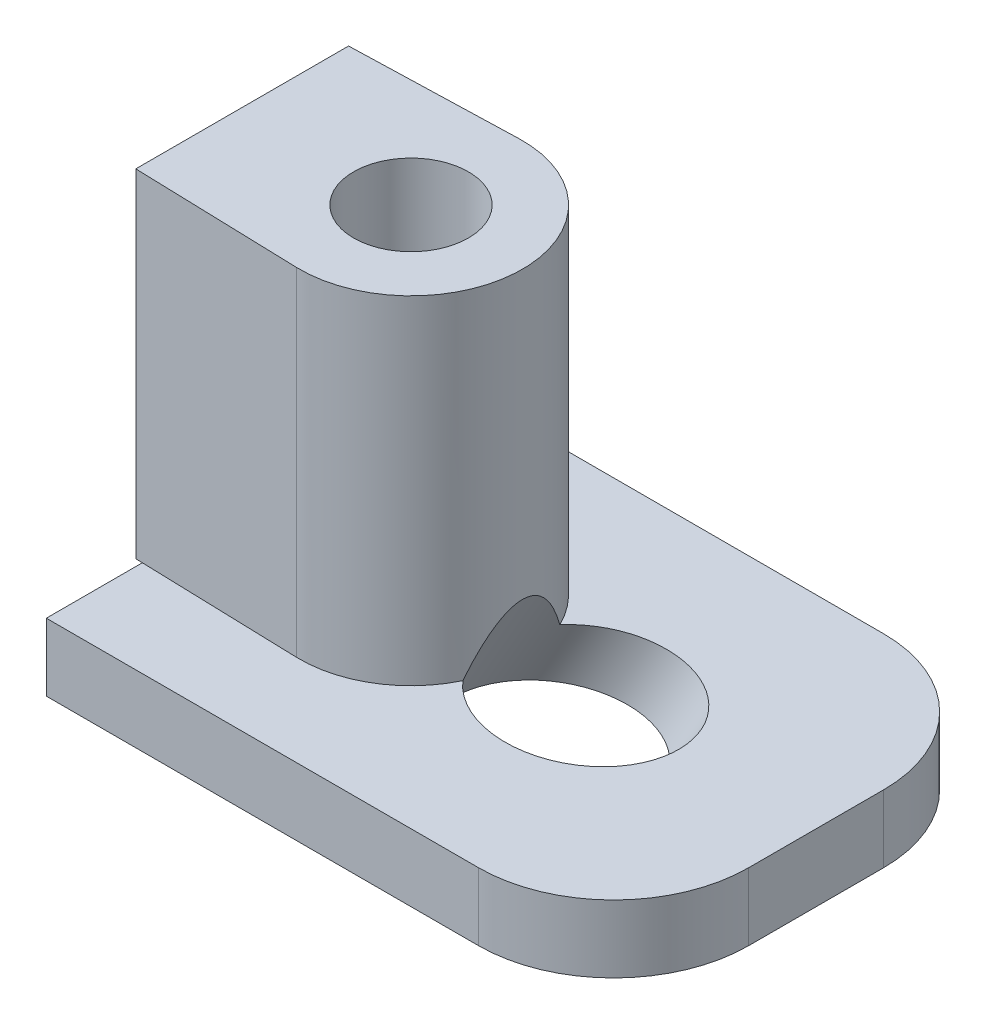
ISO-10303-21;
HEADER;
FILE_DESCRIPTION(('STEP AP214'),'2;1');
FILE_NAME('part.step','',(''),(''),'','','');
FILE_SCHEMA(('AUTOMOTIVE_DESIGN { 1 0 10303 214 1 1 1 1 }'));
ENDSEC;
DATA;
#1=APPLICATION_CONTEXT('core data for automotive mechanical design processes');
#2=APPLICATION_PROTOCOL_DEFINITION('international standard','automotive_design',2000,#1);
#3=PRODUCT_CONTEXT('',#1,'mechanical');
#4=PRODUCT('Part','Part','',(#3));
#5=PRODUCT_RELATED_PRODUCT_CATEGORY('part','',(#4));
#6=PRODUCT_DEFINITION_FORMATION('','',#4);
#7=PRODUCT_DEFINITION_CONTEXT('part definition',#1,'design');
#8=PRODUCT_DEFINITION('design','',#6,#7);
#9=PRODUCT_DEFINITION_SHAPE('','',#8);
#10=(LENGTH_UNIT() NAMED_UNIT(*) SI_UNIT(.MILLI.,.METRE.));
#11=(NAMED_UNIT(*) PLANE_ANGLE_UNIT() SI_UNIT($,.RADIAN.));
#12=(NAMED_UNIT(*) SI_UNIT($,.STERADIAN.) SOLID_ANGLE_UNIT());
#13=UNCERTAINTY_MEASURE_WITH_UNIT(LENGTH_MEASURE(1.E-05),#10,'distance_accuracy_value','');
#14=(GEOMETRIC_REPRESENTATION_CONTEXT(3) GLOBAL_UNCERTAINTY_ASSIGNED_CONTEXT((#13)) GLOBAL_UNIT_ASSIGNED_CONTEXT((#10,
#11,#12)) REPRESENTATION_CONTEXT('',''));
#15=CARTESIAN_POINT('',(0.,0.,0.));
#16=DIRECTION('',(0.,0.,1.));
#17=DIRECTION('',(1.,0.,0.));
#18=AXIS2_PLACEMENT_3D('',#15,#16,#17);
#19=CARTESIAN_POINT('',(2.5,7.75,0.));
#20=DIRECTION('',(0.,1.,0.));
#21=DIRECTION('',(0.,0.,1.));
#22=AXIS2_PLACEMENT_3D('',#19,#20,#21);
#23=PLANE('',#22);
#24=DIRECTION('',(0.,0.,-1.));
#25=VECTOR('',#24,1.);
#26=CARTESIAN_POINT('',(1.30000000001017,7.75,1.49999999996326));
#27=LINE('',#26,#25);
#28=CARTESIAN_POINT('',(1.30000000001017,7.75,0.789194940442877));
#29=VERTEX_POINT('',#28);
#30=CARTESIAN_POINT('',(1.30000000001017,7.75,-0.789194940442877));
#31=VERTEX_POINT('',#30);
#32=EDGE_CURVE('E48',#29,#31,#27,.T.);
#33=ORIENTED_EDGE('',*,*,#32,.F.);
#34=DIRECTION('',(0.99954579976556,0.,0.0301362600703334));
#35=VECTOR('',#34,1.);
#36=CARTESIAN_POINT('',(2.47513758544198,7.75,0.824625284806589));
#37=LINE('',#36,#35);
#38=CARTESIAN_POINT('',(1.25000000001017,7.75,0.787687442733547));
#39=VERTEX_POINT('',#38);
#40=EDGE_CURVE('E382',#39,#29,#37,.T.);
#41=ORIENTED_EDGE('',*,*,#40,.F.);
#42=DIRECTION('',(0.,0.,1.));
#43=VECTOR('',#42,1.);
#44=CARTESIAN_POINT('',(1.25000000001017,7.75,0.787687442733547));
#45=LINE('',#44,#43);
#46=CARTESIAN_POINT('',(1.25000000001017,7.75,-0.787687442733547));
#47=VERTEX_POINT('',#46);
#48=EDGE_CURVE('E379',#47,#39,#45,.T.);
#49=ORIENTED_EDGE('',*,*,#48,.F.);
#50=DIRECTION('',(-0.99954579976556,0.,0.0301362600703315));
#51=VECTOR('',#50,1.);
#52=CARTESIAN_POINT('',(1.25000000001017,7.75,-0.787687442733547));
#53=LINE('',#52,#51);
#54=EDGE_CURVE('E370',#31,#47,#53,.T.);
#55=ORIENTED_EDGE('',*,*,#54,.F.);
#56=EDGE_LOOP('',(#33,#41,#49,#55));
#57=FACE_BOUND('',#56,.T.);
#58=ADVANCED_FACE('F39',(#57),#23,.F.);
#59=CARTESIAN_POINT('',(2.5,9.25,0.));
#60=DIRECTION('',(0.,-1.,0.));
#61=DIRECTION('',(0.,0.,-1.));
#62=AXIS2_PLACEMENT_3D('',#59,#60,#61);
#63=CYLINDRICAL_SURFACE('',#62,0.825000000000001);
#64=CARTESIAN_POINT('',(2.5,7.75,0.));
#65=DIRECTION('',(0.,1.,0.));
#66=DIRECTION('',(0.,0.,1.));
#67=AXIS2_PLACEMENT_3D('',#64,#65,#66);
#68=CIRCLE('',#67,0.825000000000001);
#69=CARTESIAN_POINT('',(2.47513758544198,7.75,0.824625284806589));
#70=VERTEX_POINT('',#69);
#71=CARTESIAN_POINT('',(3.2427713292277,7.75,0.359048398516585));
#72=VERTEX_POINT('',#71);
#73=EDGE_CURVE('E368',#70,#72,#68,.T.);
#74=ORIENTED_EDGE('',*,*,#73,.T.);
#75=CARTESIAN_POINT('',(3.2427713292277,7.75,0.359048398516585));
#76=CARTESIAN_POINT('',(3.24734672347552,7.77217971307887,0.349565049921853));
#77=CARTESIAN_POINT('',(3.25192600277813,7.79418896030448,0.33964566753348));
#78=CARTESIAN_POINT('',(3.26106805188744,7.83780146526785,0.318646845721492));
#79=CARTESIAN_POINT('',(3.26563059435548,7.85940184355562,0.307561357337247));
#80=CARTESIAN_POINT('',(3.27483349496606,7.90268314619792,0.28359900724088));
#81=CARTESIAN_POINT('',(3.27947033327997,7.92433658834901,0.270670478878927));
#82=CARTESIAN_POINT('',(3.28854048447935,7.96644084771411,0.242985116613794));
#83=CARTESIAN_POINT('',(3.29297426897767,7.98689448628587,0.228232848119379));
#84=CARTESIAN_POINT('',(3.30055565002327,8.02169384050402,0.199757082741822));
#85=CARTESIAN_POINT('',(3.30377388010276,8.03640319300004,0.186502368601944));
#86=CARTESIAN_POINT('',(3.3098203207619,8.06394792303974,0.158191350371955));
#87=CARTESIAN_POINT('',(3.31265093437802,8.07679487870224,0.143147338628181));
#88=CARTESIAN_POINT('',(3.31676217281508,8.09540823105043,0.116754702154036));
#89=CARTESIAN_POINT('',(3.31823160844037,8.10204826763883,0.106059049926062));
#90=CARTESIAN_POINT('',(3.32081305778399,8.11369928252237,0.0837634575396931));
#91=CARTESIAN_POINT('',(3.32192551622894,8.1187122878832,0.0721646650986338));
#92=CARTESIAN_POINT('',(3.32352855059013,8.12593093021106,0.050249048831502));
#93=CARTESIAN_POINT('',(3.32409262549927,8.12846862260195,0.0400487219740886));
#94=CARTESIAN_POINT('',(3.32483773061379,8.13182010354673,0.0193539820251326));
#95=CARTESIAN_POINT('',(3.32501905805271,8.13263522980936,0.00885980355493707));
#96=CARTESIAN_POINT('',(3.32497771259252,8.13244932465132,-0.0121243160797312));
#97=CARTESIAN_POINT('',(3.32475453893937,8.1314460421229,-0.0226142358903848));
#98=CARTESIAN_POINT('',(3.32392954484907,8.12773491274186,-0.0432704549303667));
#99=CARTESIAN_POINT('',(3.32332742774229,8.12502573036279,-0.0534364940404541));
#100=CARTESIAN_POINT('',(3.3215517727802,8.11702845306051,-0.0764987713816014));
#101=CARTESIAN_POINT('',(3.32025530931587,8.11118467727236,-0.0891905515857784));
#102=CARTESIAN_POINT('',(3.31725174901187,8.09762121101009,-0.1134683712181));
#103=CARTESIAN_POINT('',(3.3155437219126,8.0898972703788,-0.12505182140944));
#104=CARTESIAN_POINT('',(3.31047880905792,8.0669416220475,-0.155342848088699));
#105=CARTESIAN_POINT('',(3.30683682327192,8.05038263487886,-0.172982147986076));
#106=CARTESIAN_POINT('',(3.29909159161891,8.0149946757332,-0.205823776531038));
#107=CARTESIAN_POINT('',(3.29498527036661,7.99615050094222,-0.221008018210512));
#108=CARTESIAN_POINT('',(3.28691564265625,7.9589102788101,-0.248131167074746));
#109=CARTESIAN_POINT('',(3.2829737224174,7.94063145414876,-0.260239966936255));
#110=CARTESIAN_POINT('',(3.27496842011141,7.90329940773891,-0.283190139279665));
#111=CARTESIAN_POINT('',(3.27090489842919,7.88424528605347,-0.294029978767528));
#112=CARTESIAN_POINT('',(3.26283619408453,7.84617097550688,-0.314359991022478));
#113=CARTESIAN_POINT('',(3.25883284513023,7.82716647818218,-0.323880617454054));
#114=CARTESIAN_POINT('',(3.25080948153018,7.78881967149931,-0.342062365870405));
#115=CARTESIAN_POINT('',(3.2467895441114,7.7694784476414,-0.350725802804259));
#116=CARTESIAN_POINT('',(3.2427713292277,7.75,-0.35904839851659));
#117=B_SPLINE_CURVE_WITH_KNOTS('',3,(#75,#76,#77,#78,#79,#80,#81,#82,#83,#84,#85,#86,#87,#88,
#89,#90,#91,#92,#93,#94,#95,#96,#97,#98,#99,#100,#101,#102,#103,#104,#105,#106,#107,#108,#109,
#110,#111,#112,#113,#114,#115,#116),.UNSPECIFIED.,.F.,.F.,(4,2,2,2,2,2,2,2,2,2,2,2,2,2,2,2,2,2,
2,2,4),(0.,0.0736749599645764,0.147752939160669,0.224614953753801,0.301288312807912,
0.361361320483473,0.421043184119437,0.458961245695404,0.49683188340662,0.528275531905357,
0.559694752939033,0.59115289611565,0.622635698129949,0.664494694214626,0.70644920690254,
0.779437629745386,0.852941425440353,0.919708409452639,0.986555238036391,1.05142330953229,
1.11611111969407),.UNSPECIFIED.);
#118=CARTESIAN_POINT('',(3.2427713292277,7.75,-0.359048398516584));
#119=VERTEX_POINT('',#118);
#120=EDGE_CURVE('E53',#72,#119,#117,.T.);
#121=ORIENTED_EDGE('',*,*,#120,.T.);
#122=CARTESIAN_POINT('',(2.47513758544198,7.75,-0.824625284806588));
#123=VERTEX_POINT('',#122);
#124=EDGE_CURVE('E136',#119,#123,#68,.T.);
#125=ORIENTED_EDGE('',*,*,#124,.T.);
#126=DIRECTION('',(0.,-1.,0.));
#127=VECTOR('',#126,1.);
#128=CARTESIAN_POINT('',(2.47513758544198,9.25,-0.824625284806588));
#129=LINE('',#128,#127);
#130=CARTESIAN_POINT('',(2.47513758544198,10.25,-0.824625284806588));
#131=VERTEX_POINT('',#130);
#132=EDGE_CURVE('E129',#131,#123,#129,.T.);
#133=ORIENTED_EDGE('',*,*,#132,.F.);
#134=CARTESIAN_POINT('',(2.5,10.25,0.));
#135=DIRECTION('',(0.,1.,0.));
#136=DIRECTION('',(0.,0.,1.));
#137=AXIS2_PLACEMENT_3D('',#134,#135,#136);
#138=CIRCLE('',#137,0.825000000000001);
#139=CARTESIAN_POINT('',(2.47513758544198,10.25,0.824625284806589));
#140=VERTEX_POINT('',#139);
#141=EDGE_CURVE('E134',#140,#131,#138,.T.);
#142=ORIENTED_EDGE('',*,*,#141,.F.);
#143=DIRECTION('',(0.,-1.,0.));
#144=VECTOR('',#143,1.);
#145=CARTESIAN_POINT('',(2.47513758544198,9.25,0.824625284806589));
#146=LINE('',#145,#144);
#147=EDGE_CURVE('E369',#140,#70,#146,.T.);
#148=ORIENTED_EDGE('',*,*,#147,.T.);
#149=EDGE_LOOP('',(#74,#121,#125,#133,#142,#148));
#150=FACE_BOUND('',#149,.T.);
#151=ADVANCED_FACE('F41',(#150),#63,.T.);
#152=CARTESIAN_POINT('',(1.25000000001017,9.25,-0.787687442733547));
#153=DIRECTION('',(0.0301362600703315,0.,0.99954579976556));
#154=DIRECTION('',(0.99954579976556,0.,-0.0301362600703315));
#155=AXIS2_PLACEMENT_3D('',#152,#153,#154);
#156=PLANE('',#155);
#157=EDGE_CURVE('E372',#123,#31,#53,.T.);
#158=ORIENTED_EDGE('',*,*,#157,.T.);
#159=ORIENTED_EDGE('',*,*,#54,.T.);
#160=DIRECTION('',(0.,-1.,0.));
#161=VECTOR('',#160,1.);
#162=CARTESIAN_POINT('',(1.25000000001017,9.25,-0.787687442733547));
#163=LINE('',#162,#161);
#164=CARTESIAN_POINT('',(1.25000000001017,10.25,-0.787687442733547));
#165=VERTEX_POINT('',#164);
#166=EDGE_CURVE('E139',#165,#47,#163,.T.);
#167=ORIENTED_EDGE('',*,*,#166,.F.);
#168=DIRECTION('',(-0.99954579976556,0.,0.0301362600703315));
#169=VECTOR('',#168,1.);
#170=CARTESIAN_POINT('',(2.47513758544198,10.25,-0.824625284806588));
#171=LINE('',#170,#169);
#172=EDGE_CURVE('E141',#131,#165,#171,.T.);
#173=ORIENTED_EDGE('',*,*,#172,.F.);
#174=ORIENTED_EDGE('',*,*,#132,.T.);
#175=EDGE_LOOP('',(#158,#159,#167,#173,#174));
#176=FACE_BOUND('',#175,.T.);
#177=ADVANCED_FACE('F142',(#176),#156,.F.);
#178=CARTESIAN_POINT('',(1.25000000001017,9.25,0.787687442733547));
#179=DIRECTION('',(1.,0.,0.));
#180=DIRECTION('',(0.,0.,-1.));
#181=AXIS2_PLACEMENT_3D('',#178,#179,#180);
#182=PLANE('',#181);
#183=ORIENTED_EDGE('',*,*,#48,.T.);
#184=DIRECTION('',(0.,-1.,0.));
#185=VECTOR('',#184,1.);
#186=CARTESIAN_POINT('',(1.25000000001017,9.25,0.787687442733547));
#187=LINE('',#186,#185);
#188=CARTESIAN_POINT('',(1.25000000001017,10.25,0.787687442733547));
#189=VERTEX_POINT('',#188);
#190=EDGE_CURVE('E385',#189,#39,#187,.T.);
#191=ORIENTED_EDGE('',*,*,#190,.F.);
#192=DIRECTION('',(0.,0.,1.));
#193=VECTOR('',#192,1.);
#194=CARTESIAN_POINT('',(1.25000000001017,10.25,-0.787687442733547));
#195=LINE('',#194,#193);
#196=EDGE_CURVE('E147',#165,#189,#195,.T.);
#197=ORIENTED_EDGE('',*,*,#196,.F.);
#198=ORIENTED_EDGE('',*,*,#166,.T.);
#199=EDGE_LOOP('',(#183,#191,#197,#198));
#200=FACE_BOUND('',#199,.T.);
#201=ADVANCED_FACE('F224',(#200),#182,.F.);
#202=CARTESIAN_POINT('',(2.47513758544198,9.25,0.824625284806589));
#203=DIRECTION('',(0.0301362600703333,0.,-0.99954579976556));
#204=DIRECTION('',(-0.99954579976556,0.,-0.0301362600703334));
#205=AXIS2_PLACEMENT_3D('',#202,#203,#204);
#206=PLANE('',#205);
#207=ORIENTED_EDGE('',*,*,#40,.T.);
#208=EDGE_CURVE('E381',#29,#70,#37,.T.);
#209=ORIENTED_EDGE('',*,*,#208,.T.);
#210=ORIENTED_EDGE('',*,*,#147,.F.);
#211=DIRECTION('',(0.99954579976556,0.,0.0301362600703334));
#212=VECTOR('',#211,1.);
#213=CARTESIAN_POINT('',(1.25000000001017,10.25,0.787687442733547));
#214=LINE('',#213,#212);
#215=EDGE_CURVE('E153',#189,#140,#214,.T.);
#216=ORIENTED_EDGE('',*,*,#215,.F.);
#217=ORIENTED_EDGE('',*,*,#190,.T.);
#218=EDGE_LOOP('',(#207,#209,#210,#216,#217));
#219=FACE_BOUND('',#218,.T.);
#220=ADVANCED_FACE('F182',(#219),#206,.F.);
#221=CARTESIAN_POINT('',(4.50000000001019,7.25,0.499999999963261));
#222=DIRECTION('',(0.,1.,0.));
#223=DIRECTION('',(-1.,0.,0.));
#224=AXIS2_PLACEMENT_3D('',#221,#222,#223);
#225=PLANE('',#224);
#226=CARTESIAN_POINT('',(3.50470053838943,7.25,0.));
#227=DIRECTION('',(0.,1.,0.));
#228=DIRECTION('',(1.,0.,0.));
#229=AXIS2_PLACEMENT_3D('',#226,#227,#228);
#230=ELLIPSE('',#229,0.689240751358572,0.5969);
#231=CARTESIAN_POINT('',(4.193941289748,7.25,0.));
#232=VERTEX_POINT('',#231);
#233=EDGE_CURVE('E169',#232,#232,#230,.T.);
#234=ORIENTED_EDGE('',*,*,#233,.T.);
#235=EDGE_LOOP('',(#234));
#236=FACE_BOUND('',#235,.T.);
#237=DIRECTION('',(-1.,0.,0.));
#238=VECTOR('',#237,1.);
#239=CARTESIAN_POINT('',(1.30000000001017,7.25,1.49999999996326));
#240=LINE('',#239,#238);
#241=CARTESIAN_POINT('',(4.50000000001019,7.25,1.49999999996326));
#242=VERTEX_POINT('',#241);
#243=CARTESIAN_POINT('',(1.30000000001017,7.25,1.49999999996326));
#244=VERTEX_POINT('',#243);
#245=EDGE_CURVE('E411',#242,#244,#240,.T.);
#246=ORIENTED_EDGE('',*,*,#245,.T.);
#247=DIRECTION('',(0.,0.,-1.));
#248=VECTOR('',#247,1.);
#249=CARTESIAN_POINT('',(1.30000000001017,7.25,1.49999999996326));
#250=LINE('',#249,#248);
#251=CARTESIAN_POINT('',(1.30000000001017,7.25,-1.50000000003674));
#252=VERTEX_POINT('',#251);
#253=EDGE_CURVE('E453',#244,#252,#250,.T.);
#254=ORIENTED_EDGE('',*,*,#253,.T.);
#255=DIRECTION('',(1.,0.,0.));
#256=VECTOR('',#255,1.);
#257=CARTESIAN_POINT('',(4.50000000001019,7.25,-1.50000000003674));
#258=LINE('',#257,#256);
#259=CARTESIAN_POINT('',(4.50000000001019,7.25,-1.50000000003674));
#260=VERTEX_POINT('',#259);
#261=EDGE_CURVE('E437',#252,#260,#258,.T.);
#262=ORIENTED_EDGE('',*,*,#261,.T.);
#263=CARTESIAN_POINT('',(4.50000000001019,7.25,-0.500000000036739));
#264=DIRECTION('',(0.,-1.,0.));
#265=DIRECTION('',(-1.,0.,0.));
#266=AXIS2_PLACEMENT_3D('',#263,#264,#265);
#267=CIRCLE('',#266,1.);
#268=CARTESIAN_POINT('',(5.50000000001019,7.25,-0.500000000036739));
#269=VERTEX_POINT('',#268);
#270=EDGE_CURVE('E448',#260,#269,#267,.T.);
#271=ORIENTED_EDGE('',*,*,#270,.T.);
#272=DIRECTION('',(0.,0.,1.));
#273=VECTOR('',#272,1.);
#274=CARTESIAN_POINT('',(5.50000000001019,7.25,0.499999999963261));
#275=LINE('',#274,#273);
#276=CARTESIAN_POINT('',(5.50000000001019,7.25,0.499999999963261));
#277=VERTEX_POINT('',#276);
#278=EDGE_CURVE('E445',#269,#277,#275,.T.);
#279=ORIENTED_EDGE('',*,*,#278,.T.);
#280=CARTESIAN_POINT('',(4.50000000001019,7.25,0.499999999963261));
#281=DIRECTION('',(0.,-1.,0.));
#282=DIRECTION('',(-1.,0.,0.));
#283=AXIS2_PLACEMENT_3D('',#280,#281,#282);
#284=CIRCLE('',#283,1.);
#285=EDGE_CURVE('E416',#277,#242,#284,.T.);
#286=ORIENTED_EDGE('',*,*,#285,.T.);
#287=EDGE_LOOP('',(#246,#254,#262,#271,#279,#286));
#288=FACE_BOUND('',#287,.T.);
#289=ADVANCED_FACE('F178',(#236,#288),#225,.F.);
#290=CARTESIAN_POINT('',(4.50000000001019,7.25,0.499999999963261));
#291=DIRECTION('',(0.,1.,0.));
#292=DIRECTION('',(-1.,0.,0.));
#293=AXIS2_PLACEMENT_3D('',#290,#291,#292);
#294=CYLINDRICAL_SURFACE('',#293,1.);
#295=CARTESIAN_POINT('',(4.50000000001019,7.75,0.499999999963261));
#296=DIRECTION('',(0.,-1.,0.));
#297=DIRECTION('',(-1.,0.,0.));
#298=AXIS2_PLACEMENT_3D('',#295,#296,#297);
#299=CIRCLE('',#298,1.);
#300=CARTESIAN_POINT('',(5.50000000001019,7.75,0.499999999963261));
#301=VERTEX_POINT('',#300);
#302=CARTESIAN_POINT('',(4.50000000001019,7.75,1.49999999996326));
#303=VERTEX_POINT('',#302);
#304=EDGE_CURVE('E409',#301,#303,#299,.T.);
#305=ORIENTED_EDGE('',*,*,#304,.T.);
#306=DIRECTION('',(0.,1.,0.));
#307=VECTOR('',#306,1.);
#308=CARTESIAN_POINT('',(4.50000000001019,7.25,1.49999999996326));
#309=LINE('',#308,#307);
#310=EDGE_CURVE('E412',#242,#303,#309,.T.);
#311=ORIENTED_EDGE('',*,*,#310,.F.);
#312=ORIENTED_EDGE('',*,*,#285,.F.);
#313=DIRECTION('',(0.,1.,0.));
#314=VECTOR('',#313,1.);
#315=CARTESIAN_POINT('',(5.50000000001019,7.25,0.499999999963261));
#316=LINE('',#315,#314);
#317=EDGE_CURVE('E415',#277,#301,#316,.T.);
#318=ORIENTED_EDGE('',*,*,#317,.T.);
#319=EDGE_LOOP('',(#305,#311,#312,#318));
#320=FACE_BOUND('',#319,.T.);
#321=ADVANCED_FACE('F181',(#320),#294,.T.);
#322=CARTESIAN_POINT('',(5.50000000001019,7.25,0.499999999963261));
#323=DIRECTION('',(-1.,0.,0.));
#324=DIRECTION('',(0.,-1.,0.));
#325=AXIS2_PLACEMENT_3D('',#322,#323,#324);
#326=PLANE('',#325);
#327=DIRECTION('',(0.,0.,1.));
#328=VECTOR('',#327,1.);
#329=CARTESIAN_POINT('',(5.50000000001019,7.75,0.499999999963261));
#330=LINE('',#329,#328);
#331=CARTESIAN_POINT('',(5.50000000001019,7.75,-0.500000000036739));
#332=VERTEX_POINT('',#331);
#333=EDGE_CURVE('E407',#332,#301,#330,.T.);
#334=ORIENTED_EDGE('',*,*,#333,.T.);
#335=ORIENTED_EDGE('',*,*,#317,.F.);
#336=ORIENTED_EDGE('',*,*,#278,.F.);
#337=DIRECTION('',(0.,1.,0.));
#338=VECTOR('',#337,1.);
#339=CARTESIAN_POINT('',(5.50000000001019,7.25,-0.500000000036739));
#340=LINE('',#339,#338);
#341=EDGE_CURVE('E419',#269,#332,#340,.T.);
#342=ORIENTED_EDGE('',*,*,#341,.T.);
#343=EDGE_LOOP('',(#334,#335,#336,#342));
#344=FACE_BOUND('',#343,.T.);
#345=ADVANCED_FACE('F192',(#344),#326,.F.);
#346=CARTESIAN_POINT('',(4.50000000001019,7.25,-0.500000000036739));
#347=DIRECTION('',(0.,1.,0.));
#348=DIRECTION('',(-1.,0.,0.));
#349=AXIS2_PLACEMENT_3D('',#346,#347,#348);
#350=CYLINDRICAL_SURFACE('',#349,1.);
#351=CARTESIAN_POINT('',(4.50000000001019,7.75,-0.500000000036739));
#352=DIRECTION('',(0.,-1.,0.));
#353=DIRECTION('',(-1.,0.,0.));
#354=AXIS2_PLACEMENT_3D('',#351,#352,#353);
#355=CIRCLE('',#354,1.);
#356=CARTESIAN_POINT('',(4.50000000001019,7.75,-1.50000000003674));
#357=VERTEX_POINT('',#356);
#358=EDGE_CURVE('E400',#357,#332,#355,.T.);
#359=ORIENTED_EDGE('',*,*,#358,.T.);
#360=ORIENTED_EDGE('',*,*,#341,.F.);
#361=ORIENTED_EDGE('',*,*,#270,.F.);
#362=DIRECTION('',(0.,1.,0.));
#363=VECTOR('',#362,1.);
#364=CARTESIAN_POINT('',(4.50000000001019,7.25,-1.50000000003674));
#365=LINE('',#364,#363);
#366=EDGE_CURVE('E422',#260,#357,#365,.T.);
#367=ORIENTED_EDGE('',*,*,#366,.T.);
#368=EDGE_LOOP('',(#359,#360,#361,#367));
#369=FACE_BOUND('',#368,.T.);
#370=ADVANCED_FACE('F196',(#369),#350,.T.);
#371=CARTESIAN_POINT('',(4.50000000001019,7.25,-1.50000000003674));
#372=DIRECTION('',(0.,0.,1.));
#373=DIRECTION('',(1.,0.,0.));
#374=AXIS2_PLACEMENT_3D('',#371,#372,#373);
#375=PLANE('',#374);
#376=DIRECTION('',(1.,0.,0.));
#377=VECTOR('',#376,1.);
#378=CARTESIAN_POINT('',(4.50000000001019,7.75,-1.50000000003674));
#379=LINE('',#378,#377);
#380=CARTESIAN_POINT('',(1.30000000001017,7.75,-1.50000000003674));
#381=VERTEX_POINT('',#380);
#382=EDGE_CURVE('E397',#381,#357,#379,.T.);
#383=ORIENTED_EDGE('',*,*,#382,.T.);
#384=ORIENTED_EDGE('',*,*,#366,.F.);
#385=ORIENTED_EDGE('',*,*,#261,.F.);
#386=DIRECTION('',(0.,1.,0.));
#387=VECTOR('',#386,1.);
#388=CARTESIAN_POINT('',(1.30000000001017,7.25,-1.50000000003674));
#389=LINE('',#388,#387);
#390=EDGE_CURVE('E425',#252,#381,#389,.T.);
#391=ORIENTED_EDGE('',*,*,#390,.T.);
#392=EDGE_LOOP('',(#383,#384,#385,#391));
#393=FACE_BOUND('',#392,.T.);
#394=ADVANCED_FACE('F200',(#393),#375,.F.);
#395=CARTESIAN_POINT('',(1.30000000001017,7.25,1.49999999996326));
#396=DIRECTION('',(1.,0.,0.));
#397=DIRECTION('',(0.,0.,-1.));
#398=AXIS2_PLACEMENT_3D('',#395,#396,#397);
#399=PLANE('',#398);
#400=CARTESIAN_POINT('',(1.30000000001017,7.75,1.49999999996326));
#401=VERTEX_POINT('',#400);
#402=EDGE_CURVE('E392',#401,#29,#27,.T.);
#403=ORIENTED_EDGE('',*,*,#402,.T.);
#404=ORIENTED_EDGE('',*,*,#32,.T.);
#405=EDGE_CURVE('E398',#31,#381,#27,.T.);
#406=ORIENTED_EDGE('',*,*,#405,.T.);
#407=ORIENTED_EDGE('',*,*,#390,.F.);
#408=ORIENTED_EDGE('',*,*,#253,.F.);
#409=DIRECTION('',(0.,1.,0.));
#410=VECTOR('',#409,1.);
#411=CARTESIAN_POINT('',(1.30000000001017,7.25,1.49999999996326));
#412=LINE('',#411,#410);
#413=EDGE_CURVE('E395',#244,#401,#412,.T.);
#414=ORIENTED_EDGE('',*,*,#413,.T.);
#415=EDGE_LOOP('',(#403,#404,#406,#407,#408,#414));
#416=FACE_BOUND('',#415,.T.);
#417=ADVANCED_FACE('F204',(#416),#399,.F.);
#418=CARTESIAN_POINT('',(1.30000000001017,7.25,1.49999999996326));
#419=DIRECTION('',(0.,0.,-1.));
#420=DIRECTION('',(0.,1.,0.));
#421=AXIS2_PLACEMENT_3D('',#418,#419,#420);
#422=PLANE('',#421);
#423=DIRECTION('',(-1.,0.,0.));
#424=VECTOR('',#423,1.);
#425=CARTESIAN_POINT('',(1.30000000001017,7.75,1.49999999996326));
#426=LINE('',#425,#424);
#427=EDGE_CURVE('E402',#303,#401,#426,.T.);
#428=ORIENTED_EDGE('',*,*,#427,.T.);
#429=ORIENTED_EDGE('',*,*,#413,.F.);
#430=ORIENTED_EDGE('',*,*,#245,.F.);
#431=ORIENTED_EDGE('',*,*,#310,.T.);
#432=EDGE_LOOP('',(#428,#429,#430,#431));
#433=FACE_BOUND('',#432,.T.);
#434=ADVANCED_FACE('F208',(#433),#422,.F.);
#435=CARTESIAN_POINT('',(4.50000000001019,7.75,0.499999999963261));
#436=DIRECTION('',(0.,1.,0.));
#437=DIRECTION('',(-1.,0.,0.));
#438=AXIS2_PLACEMENT_3D('',#435,#436,#437);
#439=PLANE('',#438);
#440=CARTESIAN_POINT('',(3.79337567298423,7.75,0.));
#441=DIRECTION('',(0.,1.,0.));
#442=DIRECTION('',(1.,0.,0.));
#443=AXIS2_PLACEMENT_3D('',#440,#441,#442);
#444=ELLIPSE('',#443,0.689240751358572,0.5969);
#445=EDGE_CURVE('E11',#72,#119,#444,.T.);
#446=ORIENTED_EDGE('',*,*,#445,.F.);
#447=ORIENTED_EDGE('',*,*,#73,.F.);
#448=ORIENTED_EDGE('',*,*,#208,.F.);
#449=ORIENTED_EDGE('',*,*,#402,.F.);
#450=ORIENTED_EDGE('',*,*,#427,.F.);
#451=ORIENTED_EDGE('',*,*,#304,.F.);
#452=ORIENTED_EDGE('',*,*,#333,.F.);
#453=ORIENTED_EDGE('',*,*,#358,.F.);
#454=ORIENTED_EDGE('',*,*,#382,.F.);
#455=ORIENTED_EDGE('',*,*,#405,.F.);
#456=ORIENTED_EDGE('',*,*,#157,.F.);
#457=ORIENTED_EDGE('',*,*,#124,.F.);
#458=EDGE_LOOP('',(#446,#447,#448,#449,#450,#451,#452,#453,#454,#455,#456,#457));
#459=FACE_BOUND('',#458,.T.);
#460=ADVANCED_FACE('F176',(#459),#439,.T.);
#461=CARTESIAN_POINT('',(0.0644065234306004,1.29123597311608,0.));
#462=DIRECTION('',(0.499999999999993,0.866025403784443,0.));
#463=DIRECTION('',(-0.866025403784443,0.499999999999993,0.));
#464=AXIS2_PLACEMENT_3D('',#461,#462,#463);
#465=CYLINDRICAL_SURFACE('',#464,0.5969);
#466=ORIENTED_EDGE('',*,*,#445,.T.);
#467=ORIENTED_EDGE('',*,*,#120,.F.);
#468=EDGE_LOOP('',(#466,#467));
#469=FACE_BOUND('',#468,.T.);
#470=ORIENTED_EDGE('',*,*,#233,.F.);
#471=EDGE_LOOP('',(#470));
#472=FACE_BOUND('',#471,.T.);
#473=ADVANCED_FACE('F171',(#469,#472),#465,.F.);
#474=CARTESIAN_POINT('',(2.5,10.25,0.));
#475=DIRECTION('',(0.,1.,0.));
#476=DIRECTION('',(0.,0.,1.));
#477=AXIS2_PLACEMENT_3D('',#474,#475,#476);
#478=PLANE('',#477);
#479=ORIENTED_EDGE('',*,*,#141,.T.);
#480=ORIENTED_EDGE('',*,*,#172,.T.);
#481=ORIENTED_EDGE('',*,*,#196,.T.);
#482=ORIENTED_EDGE('',*,*,#215,.T.);
#483=EDGE_LOOP('',(#479,#480,#481,#482));
#484=FACE_BOUND('',#483,.T.);
#485=CARTESIAN_POINT('',(2.5,10.25,0.));
#486=DIRECTION('',(0.,1.,0.));
#487=DIRECTION('',(0.,0.,1.));
#488=AXIS2_PLACEMENT_3D('',#485,#486,#487);
#489=CIRCLE('',#488,0.425);
#490=CARTESIAN_POINT('',(2.5,10.25,0.425000000000001));
#491=VERTEX_POINT('',#490);
#492=EDGE_CURVE('E154',#491,#491,#489,.T.);
#493=ORIENTED_EDGE('',*,*,#492,.F.);
#494=EDGE_LOOP('',(#493));
#495=FACE_BOUND('',#494,.T.);
#496=ADVANCED_FACE('F150',(#484,#495),#478,.T.);
#497=CARTESIAN_POINT('',(2.5,10.25,0.));
#498=DIRECTION('',(0.,-1.,0.));
#499=DIRECTION('',(0.,0.,-1.));
#500=AXIS2_PLACEMENT_3D('',#497,#498,#499);
#501=CYLINDRICAL_SURFACE('',#500,0.425);
#502=ORIENTED_EDGE('',*,*,#492,.T.);
#503=EDGE_LOOP('',(#502));
#504=FACE_BOUND('',#503,.T.);
#505=CARTESIAN_POINT('',(2.5,9.25,0.));
#506=DIRECTION('',(0.,1.,0.));
#507=DIRECTION('',(0.,0.,1.));
#508=AXIS2_PLACEMENT_3D('',#505,#506,#507);
#509=CIRCLE('',#508,0.425);
#510=CARTESIAN_POINT('',(2.5,9.25,0.425000000000001));
#511=VERTEX_POINT('',#510);
#512=EDGE_CURVE('E157',#511,#511,#509,.T.);
#513=ORIENTED_EDGE('',*,*,#512,.F.);
#514=EDGE_LOOP('',(#513));
#515=FACE_BOUND('',#514,.T.);
#516=ADVANCED_FACE('F188',(#504,#515),#501,.F.);
#517=CARTESIAN_POINT('',(2.5,7.75,0.));
#518=DIRECTION('',(0.,1.,0.));
#519=DIRECTION('',(0.,0.,1.));
#520=AXIS2_PLACEMENT_3D('',#517,#518,#519);
#521=CIRCLE('',#520,0.374999999999997);
#522=CARTESIAN_POINT('',(2.5,7.75,0.374999999999998));
#523=VERTEX_POINT('',#522);
#524=EDGE_CURVE('E376',#523,#523,#521,.T.);
#525=ORIENTED_EDGE('',*,*,#524,.T.);
#526=EDGE_LOOP('',(#525));
#527=FACE_BOUND('',#526,.T.);
#528=ADVANCED_FACE('F184',(#527),#439,.T.);
#529=CARTESIAN_POINT('',(2.5,9.25,0.));
#530=DIRECTION('',(0.,-1.,0.));
#531=DIRECTION('',(0.,0.,-1.));
#532=AXIS2_PLACEMENT_3D('',#529,#530,#531);
#533=CYLINDRICAL_SURFACE('',#532,0.374999999999997);
#534=CARTESIAN_POINT('',(2.5,9.25,0.));
#535=DIRECTION('',(0.,1.,0.));
#536=DIRECTION('',(0.,0.,1.));
#537=AXIS2_PLACEMENT_3D('',#534,#535,#536);
#538=CIRCLE('',#537,0.374999999999997);
#539=CARTESIAN_POINT('',(2.5,9.25,0.374999999999998));
#540=VERTEX_POINT('',#539);
#541=EDGE_CURVE('E374',#540,#540,#538,.T.);
#542=ORIENTED_EDGE('',*,*,#541,.T.);
#543=EDGE_LOOP('',(#542));
#544=FACE_BOUND('',#543,.T.);
#545=ORIENTED_EDGE('',*,*,#524,.F.);
#546=EDGE_LOOP('',(#545));
#547=FACE_BOUND('',#546,.T.);
#548=ADVANCED_FACE('F187',(#544,#547),#533,.F.);
#549=CARTESIAN_POINT('',(2.5,9.25,0.));
#550=DIRECTION('',(0.,1.,0.));
#551=DIRECTION('',(0.,0.,1.));
#552=AXIS2_PLACEMENT_3D('',#549,#550,#551);
#553=PLANE('',#552);
#554=ORIENTED_EDGE('',*,*,#541,.F.);
#555=EDGE_LOOP('',(#554));
#556=FACE_BOUND('',#555,.T.);
#557=ORIENTED_EDGE('',*,*,#512,.T.);
#558=EDGE_LOOP('',(#557));
#559=FACE_BOUND('',#558,.T.);
#560=ADVANCED_FACE('F215',(#556,#559),#553,.T.);
#561=CLOSED_SHELL('',(#58,#151,#177,#201,#220,#289,#321,#345,#370,#394,#417,#434,#460,#473,#496,
#516,#528,#548,#560));
#562=MANIFOLD_SOLID_BREP('B2',#561);
#563=ADVANCED_BREP_SHAPE_REPRESENTATION('',(#18,#562),#14);
#564=SHAPE_DEFINITION_REPRESENTATION(#9,#563);
ENDSEC;
END-ISO-10303-21;
